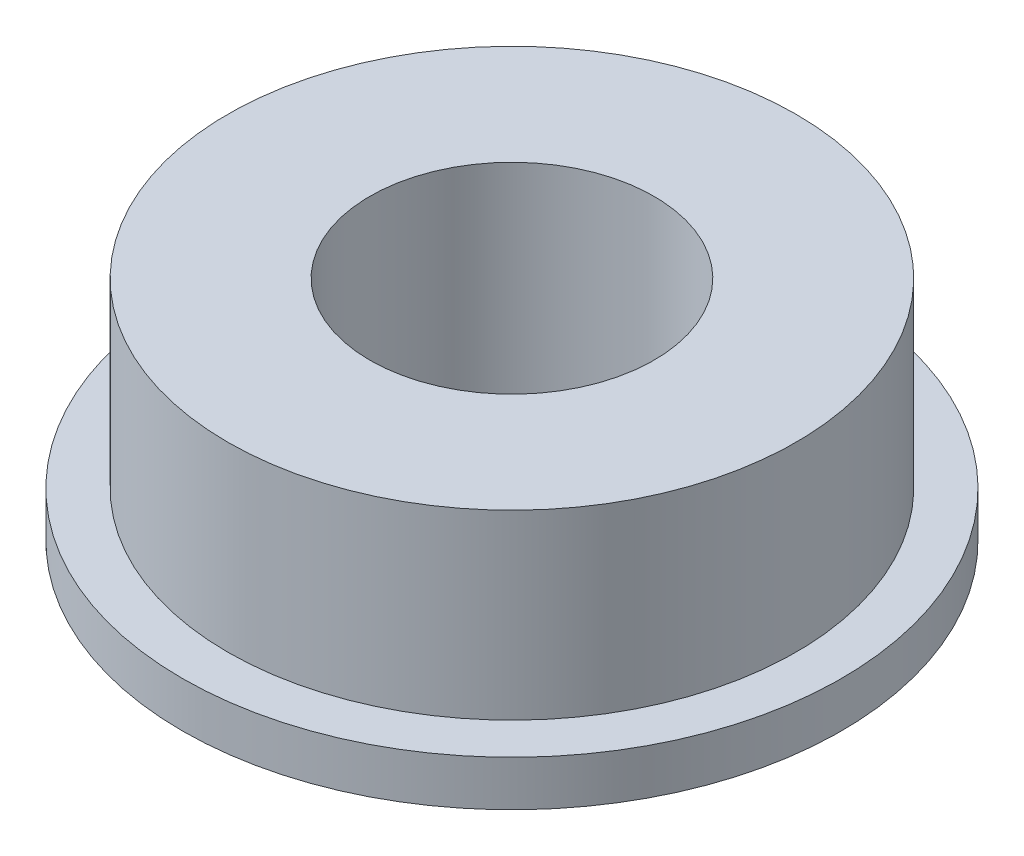
ISO-10303-21;
HEADER;
FILE_DESCRIPTION(('STEP AP214'),'2;1');
FILE_NAME('part.step','',(''),(''),'','','');
FILE_SCHEMA(('AUTOMOTIVE_DESIGN { 1 0 10303 214 1 1 1 1 }'));
ENDSEC;
DATA;
#1=APPLICATION_CONTEXT('core data for automotive mechanical design processes');
#2=APPLICATION_PROTOCOL_DEFINITION('international standard','automotive_design',2000,#1);
#3=PRODUCT_CONTEXT('',#1,'mechanical');
#4=PRODUCT('Part','Part','',(#3));
#5=PRODUCT_RELATED_PRODUCT_CATEGORY('part','',(#4));
#6=PRODUCT_DEFINITION_FORMATION('','',#4);
#7=PRODUCT_DEFINITION_CONTEXT('part definition',#1,'design');
#8=PRODUCT_DEFINITION('design','',#6,#7);
#9=PRODUCT_DEFINITION_SHAPE('','',#8);
#10=(LENGTH_UNIT() NAMED_UNIT(*) SI_UNIT(.MILLI.,.METRE.));
#11=(NAMED_UNIT(*) PLANE_ANGLE_UNIT() SI_UNIT($,.RADIAN.));
#12=(NAMED_UNIT(*) SI_UNIT($,.STERADIAN.) SOLID_ANGLE_UNIT());
#13=UNCERTAINTY_MEASURE_WITH_UNIT(LENGTH_MEASURE(1.E-05),#10,'distance_accuracy_value','');
#14=(GEOMETRIC_REPRESENTATION_CONTEXT(3) GLOBAL_UNCERTAINTY_ASSIGNED_CONTEXT((#13)) GLOBAL_UNIT_ASSIGNED_CONTEXT((#10,
#11,#12)) REPRESENTATION_CONTEXT('',''));
#15=CARTESIAN_POINT('',(0.,0.,0.));
#16=DIRECTION('',(0.,0.,1.));
#17=DIRECTION('',(1.,0.,0.));
#18=AXIS2_PLACEMENT_3D('',#15,#16,#17);
#19=CARTESIAN_POINT('',(0.,0.8,0.));
#20=DIRECTION('',(0.,-1.,0.));
#21=DIRECTION('',(0.,0.,-1.));
#22=AXIS2_PLACEMENT_3D('',#19,#20,#21);
#23=CYLINDRICAL_SURFACE('',#22,5.8);
#24=CARTESIAN_POINT('',(0.,0.8,0.));
#25=DIRECTION('',(0.,1.,0.));
#26=DIRECTION('',(0.,0.,1.));
#27=AXIS2_PLACEMENT_3D('',#24,#25,#26);
#28=CIRCLE('',#27,5.8);
#29=CARTESIAN_POINT('',(0.,0.8,5.8));
#30=VERTEX_POINT('',#29);
#31=EDGE_CURVE('E44',#30,#30,#28,.T.);
#32=ORIENTED_EDGE('',*,*,#31,.F.);
#33=EDGE_LOOP('',(#32));
#34=FACE_BOUND('',#33,.T.);
#35=CARTESIAN_POINT('',(0.,0.,0.));
#36=DIRECTION('',(0.,1.,0.));
#37=DIRECTION('',(0.,0.,1.));
#38=AXIS2_PLACEMENT_3D('',#35,#36,#37);
#39=CIRCLE('',#38,5.8);
#40=CARTESIAN_POINT('',(0.,0.,5.8));
#41=VERTEX_POINT('',#40);
#42=EDGE_CURVE('E40',#41,#41,#39,.T.);
#43=ORIENTED_EDGE('',*,*,#42,.T.);
#44=EDGE_LOOP('',(#43));
#45=FACE_BOUND('',#44,.T.);
#46=ADVANCED_FACE('F37',(#34,#45),#23,.T.);
#47=CARTESIAN_POINT('',(0.,0.8,0.));
#48=DIRECTION('',(0.,1.,0.));
#49=DIRECTION('',(0.,0.,1.));
#50=AXIS2_PLACEMENT_3D('',#47,#48,#49);
#51=PLANE('',#50);
#52=CARTESIAN_POINT('',(0.,0.8,0.));
#53=DIRECTION('',(0.,1.,0.));
#54=DIRECTION('',(0.,0.,1.));
#55=AXIS2_PLACEMENT_3D('',#52,#53,#54);
#56=CIRCLE('',#55,5.);
#57=CARTESIAN_POINT('',(0.,0.8,5.));
#58=VERTEX_POINT('',#57);
#59=EDGE_CURVE('E10',#58,#58,#56,.T.);
#60=ORIENTED_EDGE('',*,*,#59,.F.);
#61=EDGE_LOOP('',(#60));
#62=FACE_BOUND('',#61,.T.);
#63=ORIENTED_EDGE('',*,*,#31,.T.);
#64=EDGE_LOOP('',(#63));
#65=FACE_BOUND('',#64,.T.);
#66=ADVANCED_FACE('F76',(#62,#65),#51,.T.);
#67=CARTESIAN_POINT('',(0.,0.,0.));
#68=DIRECTION('',(0.,1.,0.));
#69=DIRECTION('',(0.,0.,1.));
#70=AXIS2_PLACEMENT_3D('',#67,#68,#69);
#71=PLANE('',#70);
#72=CARTESIAN_POINT('',(0.,0.,0.));
#73=DIRECTION('',(0.,1.,0.));
#74=DIRECTION('',(0.,0.,1.));
#75=AXIS2_PLACEMENT_3D('',#72,#73,#74);
#76=CIRCLE('',#75,2.50000000000001);
#77=CARTESIAN_POINT('',(0.,0.,2.50000000000001));
#78=VERTEX_POINT('',#77);
#79=EDGE_CURVE('E53',#78,#78,#76,.T.);
#80=ORIENTED_EDGE('',*,*,#79,.T.);
#81=EDGE_LOOP('',(#80));
#82=FACE_BOUND('',#81,.T.);
#83=ORIENTED_EDGE('',*,*,#42,.F.);
#84=EDGE_LOOP('',(#83));
#85=FACE_BOUND('',#84,.T.);
#86=ADVANCED_FACE('F70',(#82,#85),#71,.F.);
#87=CARTESIAN_POINT('',(0.,4.,0.));
#88=DIRECTION('',(0.,-1.,0.));
#89=DIRECTION('',(0.,0.,-1.));
#90=AXIS2_PLACEMENT_3D('',#87,#88,#89);
#91=CYLINDRICAL_SURFACE('',#90,5.);
#92=CARTESIAN_POINT('',(0.,4.,0.));
#93=DIRECTION('',(0.,1.,0.));
#94=DIRECTION('',(0.,0.,1.));
#95=AXIS2_PLACEMENT_3D('',#92,#93,#94);
#96=CIRCLE('',#95,5.);
#97=CARTESIAN_POINT('',(0.,4.,5.));
#98=VERTEX_POINT('',#97);
#99=EDGE_CURVE('E50',#98,#98,#96,.T.);
#100=ORIENTED_EDGE('',*,*,#99,.F.);
#101=EDGE_LOOP('',(#100));
#102=FACE_BOUND('',#101,.T.);
#103=ORIENTED_EDGE('',*,*,#59,.T.);
#104=EDGE_LOOP('',(#103));
#105=FACE_BOUND('',#104,.T.);
#106=ADVANCED_FACE('F65',(#102,#105),#91,.T.);
#107=CARTESIAN_POINT('',(0.,4.,0.));
#108=DIRECTION('',(0.,1.,0.));
#109=DIRECTION('',(0.,0.,1.));
#110=AXIS2_PLACEMENT_3D('',#107,#108,#109);
#111=PLANE('',#110);
#112=CARTESIAN_POINT('',(0.,4.,0.));
#113=DIRECTION('',(0.,1.,0.));
#114=DIRECTION('',(0.,0.,1.));
#115=AXIS2_PLACEMENT_3D('',#112,#113,#114);
#116=CIRCLE('',#115,2.50000000000001);
#117=CARTESIAN_POINT('',(0.,4.,2.50000000000001));
#118=VERTEX_POINT('',#117);
#119=EDGE_CURVE('E56',#118,#118,#116,.T.);
#120=ORIENTED_EDGE('',*,*,#119,.F.);
#121=EDGE_LOOP('',(#120));
#122=FACE_BOUND('',#121,.T.);
#123=ORIENTED_EDGE('',*,*,#99,.T.);
#124=EDGE_LOOP('',(#123));
#125=FACE_BOUND('',#124,.T.);
#126=ADVANCED_FACE('F62',(#122,#125),#111,.T.);
#127=CARTESIAN_POINT('',(0.,4.,0.));
#128=DIRECTION('',(0.,1.,0.));
#129=DIRECTION('',(0.,0.,1.));
#130=AXIS2_PLACEMENT_3D('',#127,#128,#129);
#131=CYLINDRICAL_SURFACE('',#130,2.50000000000001);
#132=ORIENTED_EDGE('',*,*,#79,.F.);
#133=EDGE_LOOP('',(#132));
#134=FACE_BOUND('',#133,.T.);
#135=ORIENTED_EDGE('',*,*,#119,.T.);
#136=EDGE_LOOP('',(#135));
#137=FACE_BOUND('',#136,.T.);
#138=ADVANCED_FACE('F60',(#134,#137),#131,.F.);
#139=CLOSED_SHELL('',(#46,#66,#86,#106,#126,#138));
#140=MANIFOLD_SOLID_BREP('B2',#139);
#141=ADVANCED_BREP_SHAPE_REPRESENTATION('',(#18,#140),#14);
#142=SHAPE_DEFINITION_REPRESENTATION(#9,#141);
ENDSEC;
END-ISO-10303-21;
